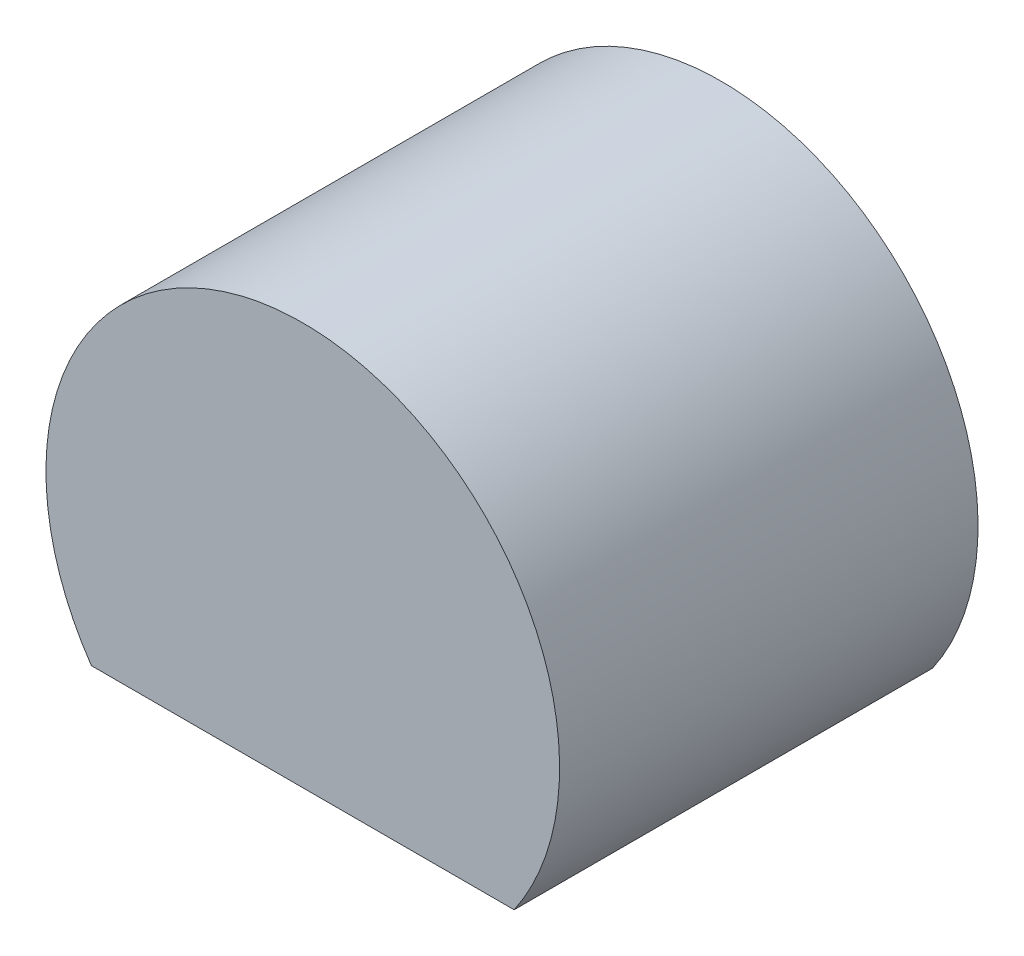
ISO-10303-21;
HEADER;
FILE_DESCRIPTION(('STEP AP214'),'2;1');
FILE_NAME('part.step','',(''),(''),'','','');
FILE_SCHEMA(('AUTOMOTIVE_DESIGN { 1 0 10303 214 1 1 1 1 }'));
ENDSEC;
DATA;
#1=APPLICATION_CONTEXT('core data for automotive mechanical design processes');
#2=APPLICATION_PROTOCOL_DEFINITION('international standard','automotive_design',2000,#1);
#3=PRODUCT_CONTEXT('',#1,'mechanical');
#4=PRODUCT('Part','Part','',(#3));
#5=PRODUCT_RELATED_PRODUCT_CATEGORY('part','',(#4));
#6=PRODUCT_DEFINITION_FORMATION('','',#4);
#7=PRODUCT_DEFINITION_CONTEXT('part definition',#1,'design');
#8=PRODUCT_DEFINITION('design','',#6,#7);
#9=PRODUCT_DEFINITION_SHAPE('','',#8);
#10=(LENGTH_UNIT() NAMED_UNIT(*) SI_UNIT(.MILLI.,.METRE.));
#11=(NAMED_UNIT(*) PLANE_ANGLE_UNIT() SI_UNIT($,.RADIAN.));
#12=(NAMED_UNIT(*) SI_UNIT($,.STERADIAN.) SOLID_ANGLE_UNIT());
#13=UNCERTAINTY_MEASURE_WITH_UNIT(LENGTH_MEASURE(1.E-05),#10,'distance_accuracy_value','');
#14=(GEOMETRIC_REPRESENTATION_CONTEXT(3) GLOBAL_UNCERTAINTY_ASSIGNED_CONTEXT((#13)) GLOBAL_UNIT_ASSIGNED_CONTEXT((#10,
#11,#12)) REPRESENTATION_CONTEXT('',''));
#15=CARTESIAN_POINT('',(0.,0.,0.));
#16=DIRECTION('',(0.,0.,1.));
#17=DIRECTION('',(1.,0.,0.));
#18=AXIS2_PLACEMENT_3D('',#15,#16,#17);
#19=CARTESIAN_POINT('',(11.0000009536743,17.,1.49999952316284));
#20=DIRECTION('',(0.,0.,1.));
#21=DIRECTION('',(1.,0.,0.));
#22=AXIS2_PLACEMENT_3D('',#19,#20,#21);
#23=PLANE('',#22);
#24=DIRECTION('',(0.999999998362673,-5.72245951337406E-05,0.));
#25=VECTOR('',#24,1.);
#26=CARTESIAN_POINT('',(-1.93467124974665,-1.33488789285951,1.49999952316284));
#27=LINE('',#26,#25);
#28=CARTESIAN_POINT('',(-1.93467328036558,-1.33488792713986,1.49999952316284));
#29=VERTEX_POINT('',#28);
#30=CARTESIAN_POINT('',(1.93451902813024,-1.33510930570702,1.49999952316284));
#31=VERTEX_POINT('',#30);
#32=EDGE_CURVE('E43',#29,#31,#27,.T.);
#33=ORIENTED_EDGE('',*,*,#32,.F.);
#34=CARTESIAN_POINT('',(-7.43093517385773E-07,2.38817394659918E-06,1.49999952316284));
#35=DIRECTION('',(0.,0.,1.));
#36=DIRECTION('',(1.,0.,0.));
#37=AXIS2_PLACEMENT_3D('',#34,#35,#36);
#38=CIRCLE('',#37,2.35050845146179);
#39=EDGE_CURVE('E20',#31,#29,#38,.T.);
#40=ORIENTED_EDGE('',*,*,#39,.F.);
#41=EDGE_LOOP('',(#33,#40));
#42=FACE_BOUND('',#41,.T.);
#43=ADVANCED_FACE('F17',(#42),#23,.F.);
#44=CARTESIAN_POINT('',(11.0000009536743,17.,5.3299994468689));
#45=DIRECTION('',(0.,0.,1.));
#46=DIRECTION('',(1.,0.,0.));
#47=AXIS2_PLACEMENT_3D('',#44,#45,#46);
#48=PLANE('',#47);
#49=DIRECTION('',(0.999999998362673,-5.72245951337406E-05,0.));
#50=VECTOR('',#49,1.);
#51=CARTESIAN_POINT('',(-1.93467124974665,-1.33488789285951,5.3299994468689));
#52=LINE('',#51,#50);
#53=CARTESIAN_POINT('',(1.93451902813024,-1.33510930570702,5.3299994468689));
#54=VERTEX_POINT('',#53);
#55=CARTESIAN_POINT('',(-1.93467328036558,-1.33488792713986,5.3299994468689));
#56=VERTEX_POINT('',#55);
#57=EDGE_CURVE('E34',#54,#56,#52,.F.);
#58=ORIENTED_EDGE('',*,*,#57,.F.);
#59=CARTESIAN_POINT('',(-7.43093517385773E-07,2.38817394659918E-06,5.3299994468689));
#60=DIRECTION('',(0.,0.,1.));
#61=DIRECTION('',(1.,0.,0.));
#62=AXIS2_PLACEMENT_3D('',#59,#60,#61);
#63=CIRCLE('',#62,2.35050845146179);
#64=EDGE_CURVE('E26',#56,#54,#63,.F.);
#65=ORIENTED_EDGE('',*,*,#64,.F.);
#66=EDGE_LOOP('',(#58,#65));
#67=FACE_BOUND('',#66,.T.);
#68=ADVANCED_FACE('F55',(#67),#48,.T.);
#69=CARTESIAN_POINT('',(-1.93467124974665,-1.33488789285951,1.49999952316284));
#70=DIRECTION('',(-5.72245951337406E-05,-0.999999998362673,0.));
#71=DIRECTION('',(0.999999998362673,-5.72245951337406E-05,0.));
#72=AXIS2_PLACEMENT_3D('',#69,#70,#71);
#73=PLANE('',#72);
#74=ORIENTED_EDGE('',*,*,#57,.T.);
#75=DIRECTION('',(0.,0.,1.));
#76=VECTOR('',#75,1.);
#77=CARTESIAN_POINT('',(-1.93467325663162,-1.33488796153777,1.49999952316284));
#78=LINE('',#77,#76);
#79=EDGE_CURVE('E48',#29,#56,#78,.T.);
#80=ORIENTED_EDGE('',*,*,#79,.F.);
#81=ORIENTED_EDGE('',*,*,#32,.T.);
#82=DIRECTION('',(0.,0.,1.));
#83=VECTOR('',#82,1.);
#84=CARTESIAN_POINT('',(1.93451902813023,-1.33510930570702,5.3299994468689));
#85=LINE('',#84,#83);
#86=EDGE_CURVE('E11',#54,#31,#85,.F.);
#87=ORIENTED_EDGE('',*,*,#86,.F.);
#88=EDGE_LOOP('',(#74,#80,#81,#87));
#89=FACE_BOUND('',#88,.T.);
#90=ADVANCED_FACE('F49',(#89),#73,.T.);
#91=CARTESIAN_POINT('',(-7.43093517385773E-07,2.38817394659918E-06,1.49999952316284));
#92=DIRECTION('',(0.,0.,1.));
#93=DIRECTION('',(1.,0.,0.));
#94=AXIS2_PLACEMENT_3D('',#91,#92,#93);
#95=CYLINDRICAL_SURFACE('',#94,2.35050845146179);
#96=ORIENTED_EDGE('',*,*,#64,.T.);
#97=ORIENTED_EDGE('',*,*,#86,.T.);
#98=ORIENTED_EDGE('',*,*,#39,.T.);
#99=ORIENTED_EDGE('',*,*,#79,.T.);
#100=EDGE_LOOP('',(#96,#97,#98,#99));
#101=FACE_BOUND('',#100,.T.);
#102=ADVANCED_FACE('F53',(#101),#95,.T.);
#103=CLOSED_SHELL('',(#43,#68,#90,#102));
#104=MANIFOLD_SOLID_BREP('B1',#103);
#105=ADVANCED_BREP_SHAPE_REPRESENTATION('',(#18,#104),#14);
#106=SHAPE_DEFINITION_REPRESENTATION(#9,#105);
ENDSEC;
END-ISO-10303-21;
